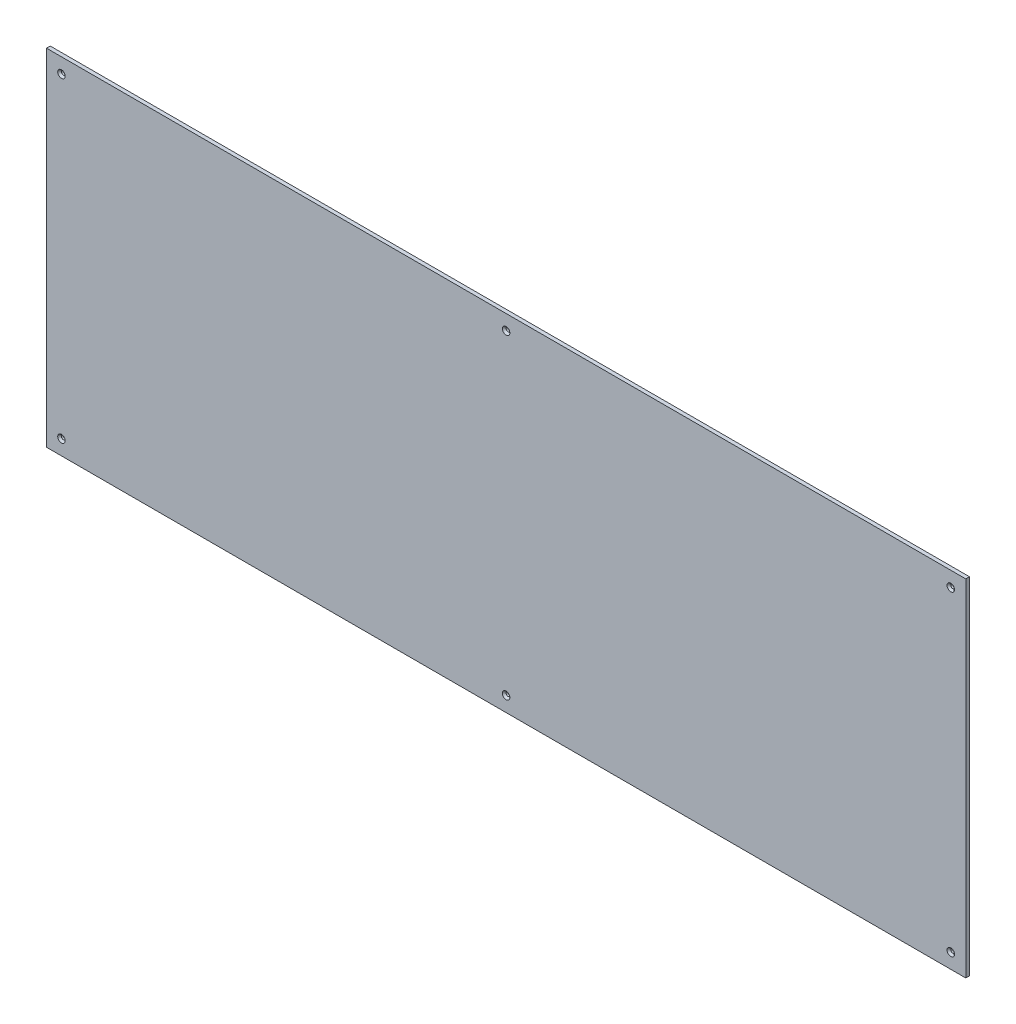
ISO-10303-21;
HEADER;
FILE_DESCRIPTION(('STEP AP214'),'2;1');
FILE_NAME('part.step','',(''),(''),'','','');
FILE_SCHEMA(('AUTOMOTIVE_DESIGN { 1 0 10303 214 1 1 1 1 }'));
ENDSEC;
DATA;
#1=APPLICATION_CONTEXT('core data for automotive mechanical design processes');
#2=APPLICATION_PROTOCOL_DEFINITION('international standard','automotive_design',2000,#1);
#3=PRODUCT_CONTEXT('',#1,'mechanical');
#4=PRODUCT('Part','Part','',(#3));
#5=PRODUCT_RELATED_PRODUCT_CATEGORY('part','',(#4));
#6=PRODUCT_DEFINITION_FORMATION('','',#4);
#7=PRODUCT_DEFINITION_CONTEXT('part definition',#1,'design');
#8=PRODUCT_DEFINITION('design','',#6,#7);
#9=PRODUCT_DEFINITION_SHAPE('','',#8);
#10=(LENGTH_UNIT() NAMED_UNIT(*) SI_UNIT(.MILLI.,.METRE.));
#11=(NAMED_UNIT(*) PLANE_ANGLE_UNIT() SI_UNIT($,.RADIAN.));
#12=(NAMED_UNIT(*) SI_UNIT($,.STERADIAN.) SOLID_ANGLE_UNIT());
#13=UNCERTAINTY_MEASURE_WITH_UNIT(LENGTH_MEASURE(1.E-05),#10,'distance_accuracy_value','');
#14=(GEOMETRIC_REPRESENTATION_CONTEXT(3) GLOBAL_UNCERTAINTY_ASSIGNED_CONTEXT((#13)) GLOBAL_UNIT_ASSIGNED_CONTEXT((#10,
#11,#12)) REPRESENTATION_CONTEXT('',''));
#15=CARTESIAN_POINT('',(0.,0.,0.));
#16=DIRECTION('',(0.,0.,1.));
#17=DIRECTION('',(1.,0.,0.));
#18=AXIS2_PLACEMENT_3D('',#15,#16,#17);
#19=CARTESIAN_POINT('',(-55.2091888091605,33.1404063205418,2.));
#20=DIRECTION('',(1.,0.,0.));
#21=DIRECTION('',(0.,1.,0.));
#22=AXIS2_PLACEMENT_3D('',#19,#20,#21);
#23=PLANE('',#22);
#24=DIRECTION('',(0.,-1.,0.));
#25=VECTOR('',#24,1.);
#26=CARTESIAN_POINT('',(-55.2091888091605,33.1404063205418,0.));
#27=LINE('',#26,#25);
#28=CARTESIAN_POINT('',(-55.2091888091605,33.1404063205418,0.));
#29=VERTEX_POINT('',#28);
#30=CARTESIAN_POINT('',(-55.2091888091605,-151.859593679458,0.));
#31=VERTEX_POINT('',#30);
#32=EDGE_CURVE('E105',#29,#31,#27,.T.);
#33=ORIENTED_EDGE('',*,*,#32,.T.);
#34=DIRECTION('',(0.,0.,-1.));
#35=VECTOR('',#34,1.);
#36=CARTESIAN_POINT('',(-55.2091888091605,-151.859593679458,2.));
#37=LINE('',#36,#35);
#38=CARTESIAN_POINT('',(-55.2091888091605,-151.859593679458,2.));
#39=VERTEX_POINT('',#38);
#40=EDGE_CURVE('E96',#39,#31,#37,.T.);
#41=ORIENTED_EDGE('',*,*,#40,.F.);
#42=DIRECTION('',(0.,-1.,0.));
#43=VECTOR('',#42,1.);
#44=CARTESIAN_POINT('',(-55.2091888091605,33.1404063205418,2.));
#45=LINE('',#44,#43);
#46=CARTESIAN_POINT('',(-55.2091888091605,33.1404063205418,2.));
#47=VERTEX_POINT('',#46);
#48=EDGE_CURVE('E90',#47,#39,#45,.T.);
#49=ORIENTED_EDGE('',*,*,#48,.F.);
#50=DIRECTION('',(0.,0.,-1.));
#51=VECTOR('',#50,1.);
#52=CARTESIAN_POINT('',(-55.2091888091605,33.1404063205418,2.));
#53=LINE('',#52,#51);
#54=EDGE_CURVE('E101',#47,#29,#53,.T.);
#55=ORIENTED_EDGE('',*,*,#54,.T.);
#56=EDGE_LOOP('',(#33,#41,#49,#55));
#57=FACE_BOUND('',#56,.T.);
#58=ADVANCED_FACE('F37',(#57),#23,.F.);
#59=CARTESIAN_POINT('',(-55.2091888091605,-151.859593679458,2.));
#60=DIRECTION('',(0.,1.,0.));
#61=DIRECTION('',(0.,0.,1.));
#62=AXIS2_PLACEMENT_3D('',#59,#60,#61);
#63=PLANE('',#62);
#64=DIRECTION('',(1.,0.,0.));
#65=VECTOR('',#64,1.);
#66=CARTESIAN_POINT('',(-55.2091888091605,-151.859593679458,0.));
#67=LINE('',#66,#65);
#68=CARTESIAN_POINT('',(436.79081119084,-151.859593679458,0.));
#69=VERTEX_POINT('',#68);
#70=EDGE_CURVE('E95',#31,#69,#67,.T.);
#71=ORIENTED_EDGE('',*,*,#70,.T.);
#72=DIRECTION('',(0.,0.,-1.));
#73=VECTOR('',#72,1.);
#74=CARTESIAN_POINT('',(436.79081119084,-151.859593679458,2.));
#75=LINE('',#74,#73);
#76=CARTESIAN_POINT('',(436.79081119084,-151.859593679458,2.));
#77=VERTEX_POINT('',#76);
#78=EDGE_CURVE('E93',#77,#69,#75,.T.);
#79=ORIENTED_EDGE('',*,*,#78,.F.);
#80=DIRECTION('',(1.,0.,0.));
#81=VECTOR('',#80,1.);
#82=CARTESIAN_POINT('',(-55.2091888091605,-151.859593679458,2.));
#83=LINE('',#82,#81);
#84=EDGE_CURVE('E85',#39,#77,#83,.T.);
#85=ORIENTED_EDGE('',*,*,#84,.F.);
#86=ORIENTED_EDGE('',*,*,#40,.T.);
#87=EDGE_LOOP('',(#71,#79,#85,#86));
#88=FACE_BOUND('',#87,.T.);
#89=ADVANCED_FACE('F94',(#88),#63,.F.);
#90=CARTESIAN_POINT('',(436.79081119084,33.1404063205418,2.));
#91=DIRECTION('',(-1.,0.,0.));
#92=DIRECTION('',(0.,0.,1.));
#93=AXIS2_PLACEMENT_3D('',#90,#91,#92);
#94=PLANE('',#93);
#95=DIRECTION('',(0.,1.,0.));
#96=VECTOR('',#95,1.);
#97=CARTESIAN_POINT('',(436.79081119084,33.1404063205418,0.));
#98=LINE('',#97,#96);
#99=CARTESIAN_POINT('',(436.79081119084,33.1404063205418,0.));
#100=VERTEX_POINT('',#99);
#101=EDGE_CURVE('E71',#69,#100,#98,.T.);
#102=ORIENTED_EDGE('',*,*,#101,.T.);
#103=DIRECTION('',(0.,0.,-1.));
#104=VECTOR('',#103,1.);
#105=CARTESIAN_POINT('',(436.79081119084,33.1404063205418,2.));
#106=LINE('',#105,#104);
#107=CARTESIAN_POINT('',(436.79081119084,33.1404063205418,2.));
#108=VERTEX_POINT('',#107);
#109=EDGE_CURVE('E97',#108,#100,#106,.T.);
#110=ORIENTED_EDGE('',*,*,#109,.F.);
#111=DIRECTION('',(0.,1.,0.));
#112=VECTOR('',#111,1.);
#113=CARTESIAN_POINT('',(436.79081119084,33.1404063205418,2.));
#114=LINE('',#113,#112);
#115=EDGE_CURVE('E88',#77,#108,#114,.T.);
#116=ORIENTED_EDGE('',*,*,#115,.F.);
#117=ORIENTED_EDGE('',*,*,#78,.T.);
#118=EDGE_LOOP('',(#102,#110,#116,#117));
#119=FACE_BOUND('',#118,.T.);
#120=ADVANCED_FACE('F99',(#119),#94,.F.);
#121=CARTESIAN_POINT('',(-55.2091888091605,33.1404063205418,2.));
#122=DIRECTION('',(0.,-1.,0.));
#123=DIRECTION('',(0.,0.,-1.));
#124=AXIS2_PLACEMENT_3D('',#121,#122,#123);
#125=PLANE('',#124);
#126=DIRECTION('',(-1.,0.,0.));
#127=VECTOR('',#126,1.);
#128=CARTESIAN_POINT('',(-55.2091888091605,33.1404063205418,0.));
#129=LINE('',#128,#127);
#130=EDGE_CURVE('E77',#100,#29,#129,.T.);
#131=ORIENTED_EDGE('',*,*,#130,.T.);
#132=ORIENTED_EDGE('',*,*,#54,.F.);
#133=DIRECTION('',(-1.,0.,0.));
#134=VECTOR('',#133,1.);
#135=CARTESIAN_POINT('',(-55.2091888091605,33.1404063205418,2.));
#136=LINE('',#135,#134);
#137=EDGE_CURVE('E54',#108,#47,#136,.T.);
#138=ORIENTED_EDGE('',*,*,#137,.F.);
#139=ORIENTED_EDGE('',*,*,#109,.T.);
#140=EDGE_LOOP('',(#131,#132,#138,#139));
#141=FACE_BOUND('',#140,.T.);
#142=ADVANCED_FACE('F159',(#141),#125,.F.);
#143=CARTESIAN_POINT('',(0.,0.,2.));
#144=DIRECTION('',(0.,0.,1.));
#145=DIRECTION('',(1.,0.,0.));
#146=AXIS2_PLACEMENT_3D('',#143,#144,#145);
#147=PLANE('',#146);
#148=CARTESIAN_POINT('',(428.79081119084,-143.859593679458,2.));
#149=DIRECTION('',(0.,0.,1.));
#150=DIRECTION('',(1.,0.,0.));
#151=AXIS2_PLACEMENT_3D('',#148,#149,#150);
#152=CIRCLE('',#151,1.99999999999995);
#153=CARTESIAN_POINT('',(430.790811190839,-143.859593679458,2.));
#154=VERTEX_POINT('',#153);
#155=EDGE_CURVE('E130',#154,#154,#152,.F.);
#156=ORIENTED_EDGE('',*,*,#155,.T.);
#157=EDGE_LOOP('',(#156));
#158=FACE_BOUND('',#157,.T.);
#159=CARTESIAN_POINT('',(428.79081119084,25.1404063205418,2.));
#160=DIRECTION('',(0.,0.,1.));
#161=DIRECTION('',(1.,0.,0.));
#162=AXIS2_PLACEMENT_3D('',#159,#160,#161);
#163=CIRCLE('',#162,1.99999999999995);
#164=CARTESIAN_POINT('',(430.790811190839,25.1404063205418,2.));
#165=VERTEX_POINT('',#164);
#166=EDGE_CURVE('E127',#165,#165,#163,.F.);
#167=ORIENTED_EDGE('',*,*,#166,.T.);
#168=EDGE_LOOP('',(#167));
#169=FACE_BOUND('',#168,.T.);
#170=CARTESIAN_POINT('',(190.79081119084,25.1404063205418,2.));
#171=DIRECTION('',(0.,0.,1.));
#172=DIRECTION('',(1.,0.,0.));
#173=AXIS2_PLACEMENT_3D('',#170,#171,#172);
#174=CIRCLE('',#173,1.99999999999995);
#175=CARTESIAN_POINT('',(192.790811190839,25.1404063205418,2.));
#176=VERTEX_POINT('',#175);
#177=EDGE_CURVE('E124',#176,#176,#174,.F.);
#178=ORIENTED_EDGE('',*,*,#177,.T.);
#179=EDGE_LOOP('',(#178));
#180=FACE_BOUND('',#179,.T.);
#181=CARTESIAN_POINT('',(190.79081119084,-143.859593679458,2.));
#182=DIRECTION('',(0.,0.,1.));
#183=DIRECTION('',(1.,0.,0.));
#184=AXIS2_PLACEMENT_3D('',#181,#182,#183);
#185=CIRCLE('',#184,1.99999999999995);
#186=CARTESIAN_POINT('',(192.790811190839,-143.859593679458,2.));
#187=VERTEX_POINT('',#186);
#188=EDGE_CURVE('E121',#187,#187,#185,.F.);
#189=ORIENTED_EDGE('',*,*,#188,.T.);
#190=EDGE_LOOP('',(#189));
#191=FACE_BOUND('',#190,.T.);
#192=CARTESIAN_POINT('',(-47.2091888091605,-143.859593679458,2.));
#193=DIRECTION('',(0.,0.,1.));
#194=DIRECTION('',(1.,0.,0.));
#195=AXIS2_PLACEMENT_3D('',#192,#193,#194);
#196=CIRCLE('',#195,2.00000000000006);
#197=CARTESIAN_POINT('',(-45.2091888091604,-143.859593679458,2.));
#198=VERTEX_POINT('',#197);
#199=EDGE_CURVE('E118',#198,#198,#196,.F.);
#200=ORIENTED_EDGE('',*,*,#199,.T.);
#201=EDGE_LOOP('',(#200));
#202=FACE_BOUND('',#201,.T.);
#203=CARTESIAN_POINT('',(-47.2091888091605,25.1404063205418,2.));
#204=DIRECTION('',(0.,0.,1.));
#205=DIRECTION('',(1.,0.,0.));
#206=AXIS2_PLACEMENT_3D('',#203,#204,#205);
#207=CIRCLE('',#206,2.00000000000006);
#208=CARTESIAN_POINT('',(-45.2091888091604,25.1404063205418,2.));
#209=VERTEX_POINT('',#208);
#210=EDGE_CURVE('E115',#209,#209,#207,.F.);
#211=ORIENTED_EDGE('',*,*,#210,.T.);
#212=EDGE_LOOP('',(#211));
#213=FACE_BOUND('',#212,.T.);
#214=ORIENTED_EDGE('',*,*,#48,.T.);
#215=ORIENTED_EDGE('',*,*,#84,.T.);
#216=ORIENTED_EDGE('',*,*,#115,.T.);
#217=ORIENTED_EDGE('',*,*,#137,.T.);
#218=EDGE_LOOP('',(#214,#215,#216,#217));
#219=FACE_BOUND('',#218,.T.);
#220=ADVANCED_FACE('F86',(#158,#169,#180,#191,#202,#213,#219),#147,.T.);
#221=CARTESIAN_POINT('',(0.,0.,0.));
#222=DIRECTION('',(0.,0.,1.));
#223=DIRECTION('',(1.,0.,0.));
#224=AXIS2_PLACEMENT_3D('',#221,#222,#223);
#225=PLANE('',#224);
#226=CARTESIAN_POINT('',(428.79081119084,-143.859593679458,0.));
#227=DIRECTION('',(0.,0.,-1.));
#228=DIRECTION('',(-1.,0.,0.));
#229=AXIS2_PLACEMENT_3D('',#226,#227,#228);
#230=CIRCLE('',#229,0.999999999999998);
#231=CARTESIAN_POINT('',(427.79081119084,-143.859593679458,0.));
#232=VERTEX_POINT('',#231);
#233=EDGE_CURVE('E209',#232,#232,#230,.T.);
#234=ORIENTED_EDGE('',*,*,#233,.F.);
#235=EDGE_LOOP('',(#234));
#236=FACE_BOUND('',#235,.T.);
#237=CARTESIAN_POINT('',(190.79081119084,-143.859593679458,0.));
#238=DIRECTION('',(0.,0.,-1.));
#239=DIRECTION('',(-1.,0.,0.));
#240=AXIS2_PLACEMENT_3D('',#237,#238,#239);
#241=CIRCLE('',#240,0.999999999999998);
#242=CARTESIAN_POINT('',(189.79081119084,-143.859593679458,0.));
#243=VERTEX_POINT('',#242);
#244=EDGE_CURVE('E206',#243,#243,#241,.T.);
#245=ORIENTED_EDGE('',*,*,#244,.F.);
#246=EDGE_LOOP('',(#245));
#247=FACE_BOUND('',#246,.T.);
#248=CARTESIAN_POINT('',(-47.2091888091605,-143.859593679458,0.));
#249=DIRECTION('',(0.,0.,-1.));
#250=DIRECTION('',(-1.,0.,0.));
#251=AXIS2_PLACEMENT_3D('',#248,#249,#250);
#252=CIRCLE('',#251,0.999999999999998);
#253=CARTESIAN_POINT('',(-48.2091888091605,-143.859593679458,0.));
#254=VERTEX_POINT('',#253);
#255=EDGE_CURVE('E208',#254,#254,#252,.T.);
#256=ORIENTED_EDGE('',*,*,#255,.F.);
#257=EDGE_LOOP('',(#256));
#258=FACE_BOUND('',#257,.T.);
#259=CARTESIAN_POINT('',(428.79081119084,25.1404063205418,0.));
#260=DIRECTION('',(0.,0.,-1.));
#261=DIRECTION('',(-1.,0.,0.));
#262=AXIS2_PLACEMENT_3D('',#259,#260,#261);
#263=CIRCLE('',#262,0.999999999999998);
#264=CARTESIAN_POINT('',(427.79081119084,25.1404063205418,0.));
#265=VERTEX_POINT('',#264);
#266=EDGE_CURVE('E212',#265,#265,#263,.T.);
#267=ORIENTED_EDGE('',*,*,#266,.F.);
#268=EDGE_LOOP('',(#267));
#269=FACE_BOUND('',#268,.T.);
#270=CARTESIAN_POINT('',(190.79081119084,25.1404063205418,0.));
#271=DIRECTION('',(0.,0.,-1.));
#272=DIRECTION('',(-1.,0.,0.));
#273=AXIS2_PLACEMENT_3D('',#270,#271,#272);
#274=CIRCLE('',#273,0.999999999999998);
#275=CARTESIAN_POINT('',(189.79081119084,25.1404063205418,0.));
#276=VERTEX_POINT('',#275);
#277=EDGE_CURVE('E219',#276,#276,#274,.T.);
#278=ORIENTED_EDGE('',*,*,#277,.F.);
#279=EDGE_LOOP('',(#278));
#280=FACE_BOUND('',#279,.T.);
#281=CARTESIAN_POINT('',(-47.2091888091605,25.1404063205418,0.));
#282=DIRECTION('',(0.,0.,-1.));
#283=DIRECTION('',(-1.,0.,0.));
#284=AXIS2_PLACEMENT_3D('',#281,#282,#283);
#285=CIRCLE('',#284,0.999999999999998);
#286=CARTESIAN_POINT('',(-48.2091888091605,25.1404063205418,0.));
#287=VERTEX_POINT('',#286);
#288=EDGE_CURVE('E108',#287,#287,#285,.T.);
#289=ORIENTED_EDGE('',*,*,#288,.F.);
#290=EDGE_LOOP('',(#289));
#291=FACE_BOUND('',#290,.T.);
#292=ORIENTED_EDGE('',*,*,#32,.F.);
#293=ORIENTED_EDGE('',*,*,#130,.F.);
#294=ORIENTED_EDGE('',*,*,#101,.F.);
#295=ORIENTED_EDGE('',*,*,#70,.F.);
#296=EDGE_LOOP('',(#292,#293,#294,#295));
#297=FACE_BOUND('',#296,.T.);
#298=ADVANCED_FACE('F158',(#236,#247,#258,#269,#280,#291,#297),#225,.F.);
#299=CARTESIAN_POINT('',(-47.2091888091605,25.1404063205418,2.));
#300=DIRECTION('',(0.,0.,-1.));
#301=DIRECTION('',(-1.,0.,0.));
#302=AXIS2_PLACEMENT_3D('',#299,#300,#301);
#303=CYLINDRICAL_SURFACE('',#302,0.999999999999998);
#304=CARTESIAN_POINT('',(-47.2091888091605,25.1404063205418,0.999999999999951));
#305=DIRECTION('',(0.,0.,1.));
#306=DIRECTION('',(1.,0.,0.));
#307=AXIS2_PLACEMENT_3D('',#304,#305,#306);
#308=CIRCLE('',#307,0.999999999999998);
#309=CARTESIAN_POINT('',(-46.2091888091605,25.1404063205418,0.999999999999951));
#310=VERTEX_POINT('',#309);
#311=EDGE_CURVE('E11',#310,#310,#308,.T.);
#312=ORIENTED_EDGE('',*,*,#311,.T.);
#313=EDGE_LOOP('',(#312));
#314=FACE_BOUND('',#313,.T.);
#315=ORIENTED_EDGE('',*,*,#288,.T.);
#316=EDGE_LOOP('',(#315));
#317=FACE_BOUND('',#316,.T.);
#318=ADVANCED_FACE('F225',(#314,#317),#303,.F.);
#319=CARTESIAN_POINT('',(190.79081119084,25.1404063205418,2.));
#320=DIRECTION('',(0.,0.,-1.));
#321=DIRECTION('',(-1.,0.,0.));
#322=AXIS2_PLACEMENT_3D('',#319,#320,#321);
#323=CYLINDRICAL_SURFACE('',#322,0.999999999999998);
#324=CARTESIAN_POINT('',(190.79081119084,25.1404063205418,1.0000000000001));
#325=DIRECTION('',(0.,0.,1.));
#326=DIRECTION('',(1.,0.,0.));
#327=AXIS2_PLACEMENT_3D('',#324,#325,#326);
#328=CIRCLE('',#327,0.999999999999998);
#329=CARTESIAN_POINT('',(191.79081119084,25.1404063205418,1.0000000000001));
#330=VERTEX_POINT('',#329);
#331=EDGE_CURVE('E139',#330,#330,#328,.T.);
#332=ORIENTED_EDGE('',*,*,#331,.T.);
#333=EDGE_LOOP('',(#332));
#334=FACE_BOUND('',#333,.T.);
#335=ORIENTED_EDGE('',*,*,#277,.T.);
#336=EDGE_LOOP('',(#335));
#337=FACE_BOUND('',#336,.T.);
#338=ADVANCED_FACE('F240',(#334,#337),#323,.F.);
#339=CARTESIAN_POINT('',(428.79081119084,25.1404063205418,2.));
#340=DIRECTION('',(0.,0.,-1.));
#341=DIRECTION('',(-1.,0.,0.));
#342=AXIS2_PLACEMENT_3D('',#339,#340,#341);
#343=CYLINDRICAL_SURFACE('',#342,0.999999999999998);
#344=CARTESIAN_POINT('',(428.79081119084,25.1404063205418,1.0000000000001));
#345=DIRECTION('',(0.,0.,1.));
#346=DIRECTION('',(1.,0.,0.));
#347=AXIS2_PLACEMENT_3D('',#344,#345,#346);
#348=CIRCLE('',#347,0.999999999999998);
#349=CARTESIAN_POINT('',(429.79081119084,25.1404063205418,1.0000000000001));
#350=VERTEX_POINT('',#349);
#351=EDGE_CURVE('E136',#350,#350,#348,.T.);
#352=ORIENTED_EDGE('',*,*,#351,.T.);
#353=EDGE_LOOP('',(#352));
#354=FACE_BOUND('',#353,.T.);
#355=ORIENTED_EDGE('',*,*,#266,.T.);
#356=EDGE_LOOP('',(#355));
#357=FACE_BOUND('',#356,.T.);
#358=ADVANCED_FACE('F244',(#354,#357),#343,.F.);
#359=CARTESIAN_POINT('',(-47.2091888091605,-143.859593679458,2.));
#360=DIRECTION('',(0.,0.,-1.));
#361=DIRECTION('',(-1.,0.,0.));
#362=AXIS2_PLACEMENT_3D('',#359,#360,#361);
#363=CYLINDRICAL_SURFACE('',#362,0.999999999999998);
#364=CARTESIAN_POINT('',(-47.2091888091605,-143.859593679458,0.999999999999951));
#365=DIRECTION('',(0.,0.,1.));
#366=DIRECTION('',(1.,0.,0.));
#367=AXIS2_PLACEMENT_3D('',#364,#365,#366);
#368=CIRCLE('',#367,0.999999999999998);
#369=CARTESIAN_POINT('',(-46.2091888091605,-143.859593679458,0.999999999999951));
#370=VERTEX_POINT('',#369);
#371=EDGE_CURVE('E46',#370,#370,#368,.T.);
#372=ORIENTED_EDGE('',*,*,#371,.T.);
#373=EDGE_LOOP('',(#372));
#374=FACE_BOUND('',#373,.T.);
#375=ORIENTED_EDGE('',*,*,#255,.T.);
#376=EDGE_LOOP('',(#375));
#377=FACE_BOUND('',#376,.T.);
#378=ADVANCED_FACE('F147',(#374,#377),#363,.F.);
#379=CARTESIAN_POINT('',(190.79081119084,-143.859593679458,2.));
#380=DIRECTION('',(0.,0.,-1.));
#381=DIRECTION('',(-1.,0.,0.));
#382=AXIS2_PLACEMENT_3D('',#379,#380,#381);
#383=CYLINDRICAL_SURFACE('',#382,0.999999999999998);
#384=CARTESIAN_POINT('',(190.79081119084,-143.859593679458,1.0000000000001));
#385=DIRECTION('',(0.,0.,1.));
#386=DIRECTION('',(1.,0.,0.));
#387=AXIS2_PLACEMENT_3D('',#384,#385,#386);
#388=CIRCLE('',#387,0.999999999999998);
#389=CARTESIAN_POINT('',(191.79081119084,-143.859593679458,1.0000000000001));
#390=VERTEX_POINT('',#389);
#391=EDGE_CURVE('E142',#390,#390,#388,.T.);
#392=ORIENTED_EDGE('',*,*,#391,.T.);
#393=EDGE_LOOP('',(#392));
#394=FACE_BOUND('',#393,.T.);
#395=ORIENTED_EDGE('',*,*,#244,.T.);
#396=EDGE_LOOP('',(#395));
#397=FACE_BOUND('',#396,.T.);
#398=ADVANCED_FACE('F200',(#394,#397),#383,.F.);
#399=CARTESIAN_POINT('',(428.79081119084,-143.859593679458,2.));
#400=DIRECTION('',(0.,0.,-1.));
#401=DIRECTION('',(-1.,0.,0.));
#402=AXIS2_PLACEMENT_3D('',#399,#400,#401);
#403=CYLINDRICAL_SURFACE('',#402,0.999999999999998);
#404=CARTESIAN_POINT('',(428.79081119084,-143.859593679458,1.0000000000001));
#405=DIRECTION('',(0.,0.,1.));
#406=DIRECTION('',(1.,0.,0.));
#407=AXIS2_PLACEMENT_3D('',#404,#405,#406);
#408=CIRCLE('',#407,0.999999999999998);
#409=CARTESIAN_POINT('',(429.79081119084,-143.859593679458,1.0000000000001));
#410=VERTEX_POINT('',#409);
#411=EDGE_CURVE('E133',#410,#410,#408,.T.);
#412=ORIENTED_EDGE('',*,*,#411,.T.);
#413=EDGE_LOOP('',(#412));
#414=FACE_BOUND('',#413,.T.);
#415=ORIENTED_EDGE('',*,*,#233,.T.);
#416=EDGE_LOOP('',(#415));
#417=FACE_BOUND('',#416,.T.);
#418=ADVANCED_FACE('F182',(#414,#417),#403,.F.);
#419=CARTESIAN_POINT('',(428.79081119084,-143.859593679458,2.));
#420=DIRECTION('',(0.,0.,1.));
#421=DIRECTION('',(1.,0.,0.));
#422=AXIS2_PLACEMENT_3D('',#419,#420,#421);
#423=CONICAL_SURFACE('',#422,1.99999999999995,0.785398163397474);
#424=ORIENTED_EDGE('',*,*,#411,.F.);
#425=EDGE_LOOP('',(#424));
#426=FACE_BOUND('',#425,.T.);
#427=ORIENTED_EDGE('',*,*,#155,.F.);
#428=EDGE_LOOP('',(#427));
#429=FACE_BOUND('',#428,.T.);
#430=ADVANCED_FACE('F178',(#426,#429),#423,.F.);
#431=CARTESIAN_POINT('',(428.79081119084,25.1404063205418,2.));
#432=DIRECTION('',(0.,0.,1.));
#433=DIRECTION('',(1.,0.,0.));
#434=AXIS2_PLACEMENT_3D('',#431,#432,#433);
#435=CONICAL_SURFACE('',#434,1.99999999999995,0.785398163397474);
#436=ORIENTED_EDGE('',*,*,#351,.F.);
#437=EDGE_LOOP('',(#436));
#438=FACE_BOUND('',#437,.T.);
#439=ORIENTED_EDGE('',*,*,#166,.F.);
#440=EDGE_LOOP('',(#439));
#441=FACE_BOUND('',#440,.T.);
#442=ADVANCED_FACE('F181',(#438,#441),#435,.F.);
#443=CARTESIAN_POINT('',(190.79081119084,25.1404063205418,2.));
#444=DIRECTION('',(0.,0.,1.));
#445=DIRECTION('',(1.,0.,0.));
#446=AXIS2_PLACEMENT_3D('',#443,#444,#445);
#447=CONICAL_SURFACE('',#446,1.99999999999995,0.785398163397474);
#448=ORIENTED_EDGE('',*,*,#331,.F.);
#449=EDGE_LOOP('',(#448));
#450=FACE_BOUND('',#449,.T.);
#451=ORIENTED_EDGE('',*,*,#177,.F.);
#452=EDGE_LOOP('',(#451));
#453=FACE_BOUND('',#452,.T.);
#454=ADVANCED_FACE('F186',(#450,#453),#447,.F.);
#455=CARTESIAN_POINT('',(190.79081119084,-143.859593679458,2.));
#456=DIRECTION('',(0.,0.,1.));
#457=DIRECTION('',(1.,0.,0.));
#458=AXIS2_PLACEMENT_3D('',#455,#456,#457);
#459=CONICAL_SURFACE('',#458,1.99999999999995,0.785398163397474);
#460=ORIENTED_EDGE('',*,*,#391,.F.);
#461=EDGE_LOOP('',(#460));
#462=FACE_BOUND('',#461,.T.);
#463=ORIENTED_EDGE('',*,*,#188,.F.);
#464=EDGE_LOOP('',(#463));
#465=FACE_BOUND('',#464,.T.);
#466=ADVANCED_FACE('F153',(#462,#465),#459,.F.);
#467=CARTESIAN_POINT('',(-47.2091888091605,-143.859593679458,2.));
#468=DIRECTION('',(0.,0.,1.));
#469=DIRECTION('',(1.,0.,0.));
#470=AXIS2_PLACEMENT_3D('',#467,#468,#469);
#471=CONICAL_SURFACE('',#470,2.00000000000006,0.785398163397454);
#472=ORIENTED_EDGE('',*,*,#371,.F.);
#473=EDGE_LOOP('',(#472));
#474=FACE_BOUND('',#473,.T.);
#475=ORIENTED_EDGE('',*,*,#199,.F.);
#476=EDGE_LOOP('',(#475));
#477=FACE_BOUND('',#476,.T.);
#478=ADVANCED_FACE('F150',(#474,#477),#471,.F.);
#479=CARTESIAN_POINT('',(-47.2091888091605,25.1404063205418,2.));
#480=DIRECTION('',(0.,0.,1.));
#481=DIRECTION('',(1.,0.,0.));
#482=AXIS2_PLACEMENT_3D('',#479,#480,#481);
#483=CONICAL_SURFACE('',#482,2.00000000000006,0.785398163397454);
#484=ORIENTED_EDGE('',*,*,#311,.F.);
#485=EDGE_LOOP('',(#484));
#486=FACE_BOUND('',#485,.T.);
#487=ORIENTED_EDGE('',*,*,#210,.F.);
#488=EDGE_LOOP('',(#487));
#489=FACE_BOUND('',#488,.T.);
#490=ADVANCED_FACE('F39',(#486,#489),#483,.F.);
#491=CLOSED_SHELL('',(#58,#89,#120,#142,#220,#298,#318,#338,#358,#378,#398,#418,#430,#442,#454,
#466,#478,#490));
#492=MANIFOLD_SOLID_BREP('B2',#491);
#493=ADVANCED_BREP_SHAPE_REPRESENTATION('',(#18,#492),#14);
#494=SHAPE_DEFINITION_REPRESENTATION(#9,#493);
ENDSEC;
END-ISO-10303-21;
